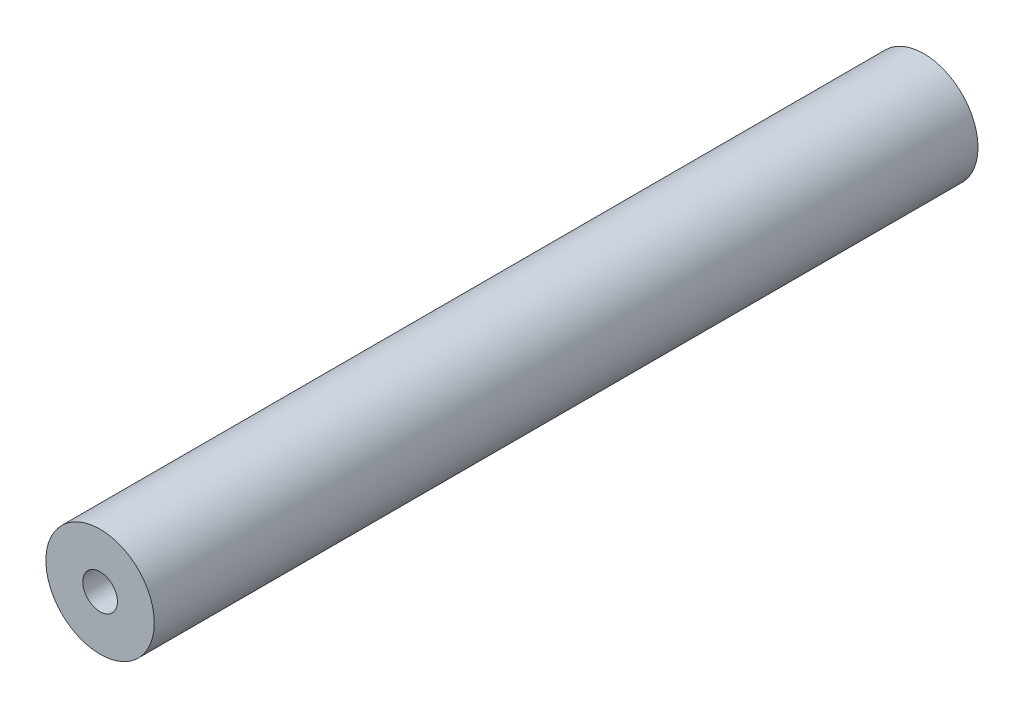
ISO-10303-21;
HEADER;
FILE_DESCRIPTION(('STEP AP214'),'2;1');
FILE_NAME('part.step','',(''),(''),'','','');
FILE_SCHEMA(('AUTOMOTIVE_DESIGN { 1 0 10303 214 1 1 1 1 }'));
ENDSEC;
DATA;
#1=APPLICATION_CONTEXT('core data for automotive mechanical design processes');
#2=APPLICATION_PROTOCOL_DEFINITION('international standard','automotive_design',2000,#1);
#3=PRODUCT_CONTEXT('',#1,'mechanical');
#4=PRODUCT('Part','Part','',(#3));
#5=PRODUCT_RELATED_PRODUCT_CATEGORY('part','',(#4));
#6=PRODUCT_DEFINITION_FORMATION('','',#4);
#7=PRODUCT_DEFINITION_CONTEXT('part definition',#1,'design');
#8=PRODUCT_DEFINITION('design','',#6,#7);
#9=PRODUCT_DEFINITION_SHAPE('','',#8);
#10=(LENGTH_UNIT() NAMED_UNIT(*) SI_UNIT(.MILLI.,.METRE.));
#11=(NAMED_UNIT(*) PLANE_ANGLE_UNIT() SI_UNIT($,.RADIAN.));
#12=(NAMED_UNIT(*) SI_UNIT($,.STERADIAN.) SOLID_ANGLE_UNIT());
#13=UNCERTAINTY_MEASURE_WITH_UNIT(LENGTH_MEASURE(1.E-05),#10,'distance_accuracy_value','');
#14=(GEOMETRIC_REPRESENTATION_CONTEXT(3) GLOBAL_UNCERTAINTY_ASSIGNED_CONTEXT((#13)) GLOBAL_UNIT_ASSIGNED_CONTEXT((#10,
#11,#12)) REPRESENTATION_CONTEXT('',''));
#15=CARTESIAN_POINT('',(0.,0.,0.));
#16=DIRECTION('',(0.,0.,1.));
#17=DIRECTION('',(1.,0.,0.));
#18=AXIS2_PLACEMENT_3D('',#15,#16,#17);
#19=CARTESIAN_POINT('',(0.,0.,190.));
#20=DIRECTION('',(0.,0.,-1.));
#21=DIRECTION('',(-1.,0.,0.));
#22=AXIS2_PLACEMENT_3D('',#19,#20,#21);
#23=CYLINDRICAL_SURFACE('',#22,12.5);
#24=CARTESIAN_POINT('',(0.,0.,190.));
#25=DIRECTION('',(0.,0.,1.));
#26=DIRECTION('',(1.,0.,0.));
#27=AXIS2_PLACEMENT_3D('',#24,#25,#26);
#28=CIRCLE('',#27,12.5);
#29=CARTESIAN_POINT('',(12.5,0.,190.));
#30=VERTEX_POINT('',#29);
#31=EDGE_CURVE('E10',#30,#30,#28,.T.);
#32=ORIENTED_EDGE('',*,*,#31,.F.);
#33=EDGE_LOOP('',(#32));
#34=FACE_BOUND('',#33,.T.);
#35=CARTESIAN_POINT('',(0.,0.,0.));
#36=DIRECTION('',(0.,0.,1.));
#37=DIRECTION('',(1.,0.,0.));
#38=AXIS2_PLACEMENT_3D('',#35,#36,#37);
#39=CIRCLE('',#38,12.5);
#40=CARTESIAN_POINT('',(12.5,0.,0.));
#41=VERTEX_POINT('',#40);
#42=EDGE_CURVE('E33',#41,#41,#39,.T.);
#43=ORIENTED_EDGE('',*,*,#42,.T.);
#44=EDGE_LOOP('',(#43));
#45=FACE_BOUND('',#44,.T.);
#46=ADVANCED_FACE('F30',(#34,#45),#23,.T.);
#47=CARTESIAN_POINT('',(0.,0.,190.));
#48=DIRECTION('',(0.,0.,1.));
#49=DIRECTION('',(1.,0.,0.));
#50=AXIS2_PLACEMENT_3D('',#47,#48,#49);
#51=PLANE('',#50);
#52=CARTESIAN_POINT('',(0.,0.,190.));
#53=DIRECTION('',(0.,0.,1.));
#54=DIRECTION('',(1.,0.,0.));
#55=AXIS2_PLACEMENT_3D('',#52,#53,#54);
#56=CIRCLE('',#55,4.);
#57=CARTESIAN_POINT('',(-4.,0.,190.));
#58=VERTEX_POINT('',#57);
#59=EDGE_CURVE('E40',#58,#58,#56,.F.);
#60=ORIENTED_EDGE('',*,*,#59,.T.);
#61=EDGE_LOOP('',(#60));
#62=FACE_BOUND('',#61,.T.);
#63=ORIENTED_EDGE('',*,*,#31,.T.);
#64=EDGE_LOOP('',(#63));
#65=FACE_BOUND('',#64,.T.);
#66=ADVANCED_FACE('F58',(#62,#65),#51,.T.);
#67=CARTESIAN_POINT('',(0.,0.,0.));
#68=DIRECTION('',(0.,0.,1.));
#69=DIRECTION('',(1.,0.,0.));
#70=AXIS2_PLACEMENT_3D('',#67,#68,#69);
#71=PLANE('',#70);
#72=CARTESIAN_POINT('',(0.,0.,0.));
#73=DIRECTION('',(0.,0.,1.));
#74=DIRECTION('',(1.,0.,0.));
#75=AXIS2_PLACEMENT_3D('',#72,#73,#74);
#76=CIRCLE('',#75,4.);
#77=CARTESIAN_POINT('',(-4.,0.,0.));
#78=VERTEX_POINT('',#77);
#79=EDGE_CURVE('E44',#78,#78,#76,.T.);
#80=ORIENTED_EDGE('',*,*,#79,.T.);
#81=EDGE_LOOP('',(#80));
#82=FACE_BOUND('',#81,.T.);
#83=ORIENTED_EDGE('',*,*,#42,.F.);
#84=EDGE_LOOP('',(#83));
#85=FACE_BOUND('',#84,.T.);
#86=ADVANCED_FACE('F48',(#82,#85),#71,.F.);
#87=CARTESIAN_POINT('',(0.,0.,395.));
#88=DIRECTION('',(0.,0.,-1.));
#89=DIRECTION('',(-1.,0.,0.));
#90=AXIS2_PLACEMENT_3D('',#87,#88,#89);
#91=CYLINDRICAL_SURFACE('',#90,4.);
#92=CARTESIAN_POINT('',(-4.,0.,190.));
#93=CARTESIAN_POINT('',(-4.,0.,188.020833333333));
#94=CARTESIAN_POINT('',(-4.,0.,186.041666666667));
#95=CARTESIAN_POINT('',(-4.,0.,182.083333333333));
#96=CARTESIAN_POINT('',(-4.,0.,180.104166666667));
#97=CARTESIAN_POINT('',(-4.,0.,176.145833333333));
#98=CARTESIAN_POINT('',(-4.,0.,174.166666666667));
#99=CARTESIAN_POINT('',(-4.,0.,170.208333333333));
#100=CARTESIAN_POINT('',(-4.,0.,168.229166666667));
#101=CARTESIAN_POINT('',(-4.,0.,164.270833333333));
#102=CARTESIAN_POINT('',(-4.,0.,162.291666666667));
#103=CARTESIAN_POINT('',(-4.,0.,158.333333333333));
#104=CARTESIAN_POINT('',(-4.,0.,156.354166666667));
#105=CARTESIAN_POINT('',(-4.,0.,152.395833333333));
#106=CARTESIAN_POINT('',(-4.,0.,150.416666666667));
#107=CARTESIAN_POINT('',(-4.,0.,146.458333333333));
#108=CARTESIAN_POINT('',(-4.,0.,144.479166666667));
#109=CARTESIAN_POINT('',(-4.,0.,140.520833333333));
#110=CARTESIAN_POINT('',(-4.,0.,138.541666666667));
#111=CARTESIAN_POINT('',(-4.,0.,134.583333333333));
#112=CARTESIAN_POINT('',(-4.,0.,132.604166666667));
#113=CARTESIAN_POINT('',(-4.,0.,128.645833333333));
#114=CARTESIAN_POINT('',(-4.,0.,126.666666666667));
#115=CARTESIAN_POINT('',(-4.,0.,122.708333333333));
#116=CARTESIAN_POINT('',(-4.,0.,120.729166666667));
#117=CARTESIAN_POINT('',(-4.,0.,116.770833333333));
#118=CARTESIAN_POINT('',(-4.,0.,114.791666666667));
#119=CARTESIAN_POINT('',(-4.,0.,110.833333333333));
#120=CARTESIAN_POINT('',(-4.,0.,108.854166666667));
#121=CARTESIAN_POINT('',(-4.,0.,104.895833333333));
#122=CARTESIAN_POINT('',(-4.,0.,102.916666666667));
#123=CARTESIAN_POINT('',(-4.,0.,98.9583333333333));
#124=CARTESIAN_POINT('',(-4.,0.,96.9791666666666));
#125=CARTESIAN_POINT('',(-4.,0.,93.0208333333333));
#126=CARTESIAN_POINT('',(-4.,0.,91.0416666666666));
#127=CARTESIAN_POINT('',(-4.,0.,87.0833333333333));
#128=CARTESIAN_POINT('',(-4.,0.,85.1041666666666));
#129=CARTESIAN_POINT('',(-4.,0.,81.1458333333333));
#130=CARTESIAN_POINT('',(-4.,0.,79.1666666666666));
#131=CARTESIAN_POINT('',(-4.,0.,75.2083333333333));
#132=CARTESIAN_POINT('',(-4.,0.,73.2291666666666));
#133=CARTESIAN_POINT('',(-4.,0.,69.2708333333333));
#134=CARTESIAN_POINT('',(-4.,0.,67.2916666666666));
#135=CARTESIAN_POINT('',(-4.,0.,63.3333333333333));
#136=CARTESIAN_POINT('',(-4.,0.,61.3541666666666));
#137=CARTESIAN_POINT('',(-4.,0.,57.3958333333333));
#138=CARTESIAN_POINT('',(-4.,0.,55.4166666666666));
#139=CARTESIAN_POINT('',(-4.,0.,51.4583333333333));
#140=CARTESIAN_POINT('',(-4.,0.,49.4791666666666));
#141=CARTESIAN_POINT('',(-4.,0.,45.5208333333333));
#142=CARTESIAN_POINT('',(-4.,0.,43.5416666666666));
#143=CARTESIAN_POINT('',(-4.,0.,39.5833333333333));
#144=CARTESIAN_POINT('',(-4.,0.,37.6041666666666));
#145=CARTESIAN_POINT('',(-4.,0.,33.6458333333333));
#146=CARTESIAN_POINT('',(-4.,0.,31.6666666666666));
#147=CARTESIAN_POINT('',(-4.,0.,27.7083333333333));
#148=CARTESIAN_POINT('',(-4.,0.,25.7291666666666));
#149=CARTESIAN_POINT('',(-4.,0.,21.7708333333333));
#150=CARTESIAN_POINT('',(-4.,0.,19.7916666666666));
#151=CARTESIAN_POINT('',(-4.,0.,15.8333333333333));
#152=CARTESIAN_POINT('',(-4.,0.,13.8541666666666));
#153=CARTESIAN_POINT('',(-4.,0.,9.89583333333327));
#154=CARTESIAN_POINT('',(-4.,0.,7.91666666666663));
#155=CARTESIAN_POINT('',(-4.,0.,3.9583333333333));
#156=CARTESIAN_POINT('',(-4.,0.,1.97916666666662));
#157=CARTESIAN_POINT('',(-4.,0.,0.));
#158=B_SPLINE_CURVE_WITH_KNOTS('',3,(#92,#93,#94,#95,#96,#97,#98,#99,#100,#101,#102,#103,#104,
#105,#106,#107,#108,#109,#110,#111,#112,#113,#114,#115,#116,#117,#118,#119,#120,#121,#122,#123,
#124,#125,#126,#127,#128,#129,#130,#131,#132,#133,#134,#135,#136,#137,#138,#139,#140,#141,#142,
#143,#144,#145,#146,#147,#148,#149,#150,#151,#152,#153,#154,#155,#156,#157),.UNSPECIFIED.,.F.,
.F.,(4,2,2,2,2,2,2,2,2,2,2,2,2,2,2,2,2,2,2,2,2,2,2,2,2,2,2,2,2,2,2,2,4),(0.,5.93750000000001,
11.875,17.8125,23.75,29.6875,35.625,41.5625,47.5,53.4375,59.375,65.3125,71.25,77.1875,83.125,
89.0625,95.,100.9375,106.875,112.8125,118.75,124.6875,130.625,136.5625,142.5,148.4375,154.375,
160.3125,166.25,172.1875,178.125,184.0625,190.),.UNSPECIFIED.);
#159=EDGE_CURVE('BSEAM51',#58,#78,#158,.T.);
#160=ORIENTED_EDGE('',*,*,#59,.F.);
#161=ORIENTED_EDGE('',*,*,#79,.F.);
#162=ORIENTED_EDGE('',*,*,#159,.T.);
#163=ORIENTED_EDGE('',*,*,#159,.F.);
#164=EDGE_LOOP('',(#160,#162,#161,#163));
#165=FACE_BOUND('',#164,.T.);
#166=ADVANCED_FACE('F51',(#165),#91,.F.);
#167=CLOSED_SHELL('',(#46,#66,#86,#166));
#168=MANIFOLD_SOLID_BREP('B2',#167);
#169=ADVANCED_BREP_SHAPE_REPRESENTATION('',(#18,#168),#14);
#170=SHAPE_DEFINITION_REPRESENTATION(#9,#169);
ENDSEC;
END-ISO-10303-21;
